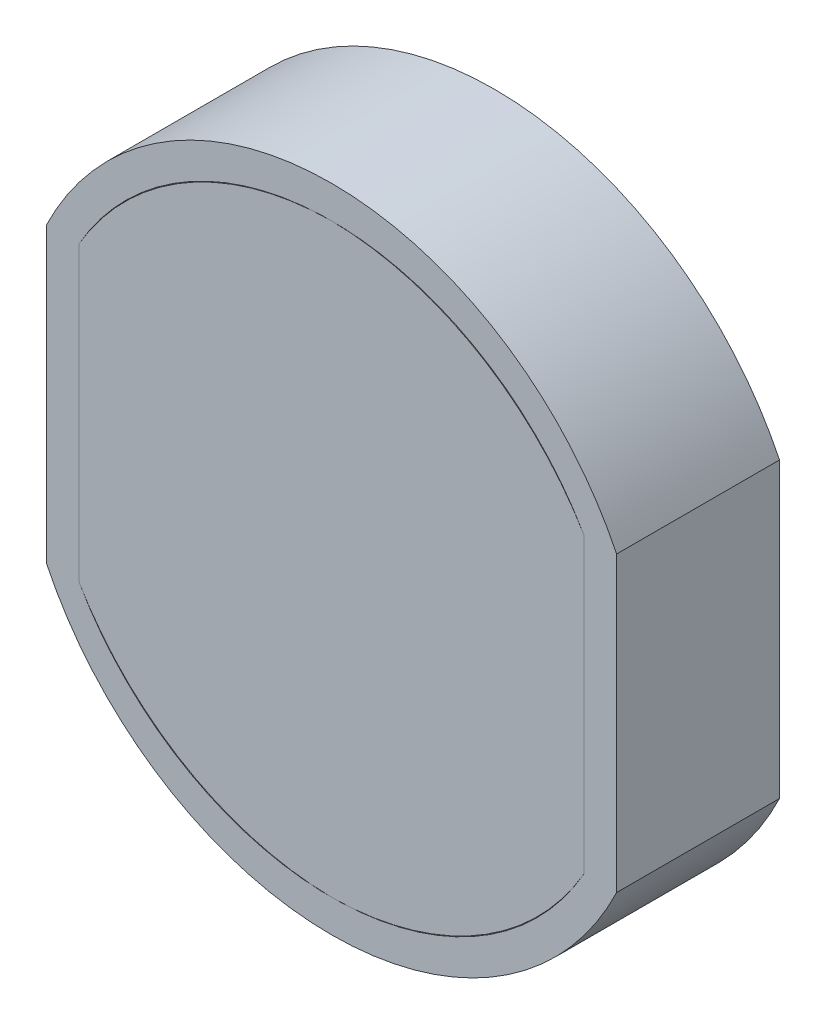
ISO-10303-21;
HEADER;
FILE_DESCRIPTION(('STEP AP214'),'2;1');
FILE_NAME('part.step','',(''),(''),'','','');
FILE_SCHEMA(('AUTOMOTIVE_DESIGN { 1 0 10303 214 1 1 1 1 }'));
ENDSEC;
DATA;
#1=APPLICATION_CONTEXT('core data for automotive mechanical design processes');
#2=APPLICATION_PROTOCOL_DEFINITION('international standard','automotive_design',2000,#1);
#3=PRODUCT_CONTEXT('',#1,'mechanical');
#4=PRODUCT('Part','Part','',(#3));
#5=PRODUCT_RELATED_PRODUCT_CATEGORY('part','',(#4));
#6=PRODUCT_DEFINITION_FORMATION('','',#4);
#7=PRODUCT_DEFINITION_CONTEXT('part definition',#1,'design');
#8=PRODUCT_DEFINITION('design','',#6,#7);
#9=PRODUCT_DEFINITION_SHAPE('','',#8);
#10=(LENGTH_UNIT() NAMED_UNIT(*) SI_UNIT(.MILLI.,.METRE.));
#11=(NAMED_UNIT(*) PLANE_ANGLE_UNIT() SI_UNIT($,.RADIAN.));
#12=(NAMED_UNIT(*) SI_UNIT($,.STERADIAN.) SOLID_ANGLE_UNIT());
#13=UNCERTAINTY_MEASURE_WITH_UNIT(LENGTH_MEASURE(1.E-05),#10,'distance_accuracy_value','');
#14=(GEOMETRIC_REPRESENTATION_CONTEXT(3) GLOBAL_UNCERTAINTY_ASSIGNED_CONTEXT((#13)) GLOBAL_UNIT_ASSIGNED_CONTEXT((#10,
#11,#12)) REPRESENTATION_CONTEXT('',''));
#15=CARTESIAN_POINT('',(0.,0.,0.));
#16=DIRECTION('',(0.,0.,1.));
#17=DIRECTION('',(1.,0.,0.));
#18=AXIS2_PLACEMENT_3D('',#15,#16,#17);
#19=CARTESIAN_POINT('',(192.028654587792,-100.042047155258,-8.49));
#20=DIRECTION('',(0.,0.,-1.));
#21=DIRECTION('',(-1.,0.,0.));
#22=AXIS2_PLACEMENT_3D('',#19,#20,#21);
#23=PLANE('',#22);
#24=CARTESIAN_POINT('',(192.028654587792,-100.042047155258,-8.49));
#25=DIRECTION('',(0.,0.,-1.));
#26=DIRECTION('',(-1.,0.,0.));
#27=AXIS2_PLACEMENT_3D('',#24,#25,#26);
#28=CIRCLE('',#27,19.4204878448053);
#29=CARTESIAN_POINT('',(209.528676,-108.462534,-8.49));
#30=VERTEX_POINT('',#29);
#31=CARTESIAN_POINT('',(174.528676,-108.462623,-8.49));
#32=VERTEX_POINT('',#31);
#33=EDGE_CURVE('P0_E140',#30,#32,#28,.T.);
#34=ORIENTED_EDGE('',*,*,#33,.T.);
#35=DIRECTION('',(0.,1.,0.));
#36=VECTOR('',#35,1.);
#37=CARTESIAN_POINT('',(174.528676,-108.462623,-8.49));
#38=LINE('',#37,#36);
#39=CARTESIAN_POINT('',(174.528676,-90.462535,-8.49));
#40=VERTEX_POINT('',#39);
#41=EDGE_CURVE('P0_E143',#32,#40,#38,.T.);
#42=ORIENTED_EDGE('',*,*,#41,.T.);
#43=CARTESIAN_POINT('',(192.028676,-98.9512156574275,-8.49));
#44=DIRECTION('',(0.,0.,-1.));
#45=DIRECTION('',(1.,0.,0.));
#46=AXIS2_PLACEMENT_3D('',#43,#44,#45);
#47=CIRCLE('',#46,19.4501336577357);
#48=CARTESIAN_POINT('',(209.528676,-90.462535,-8.49));
#49=VERTEX_POINT('',#48);
#50=EDGE_CURVE('P0_E146',#40,#49,#47,.T.);
#51=ORIENTED_EDGE('',*,*,#50,.T.);
#52=DIRECTION('',(0.,-1.,0.));
#53=VECTOR('',#52,1.);
#54=CARTESIAN_POINT('',(209.528676,-90.462535,-8.49));
#55=LINE('',#54,#53);
#56=EDGE_CURVE('P0_E148',#49,#30,#55,.T.);
#57=ORIENTED_EDGE('',*,*,#56,.T.);
#58=EDGE_LOOP('',(#34,#42,#51,#57));
#59=FACE_BOUND('',#58,.T.);
#60=DIRECTION('',(0.,-1.,0.));
#61=VECTOR('',#60,1.);
#62=CARTESIAN_POINT('',(207.528676,-90.462535,-8.49));
#63=LINE('',#62,#61);
#64=CARTESIAN_POINT('',(207.528676,-90.462535,-8.49));
#65=VERTEX_POINT('',#64);
#66=CARTESIAN_POINT('',(207.528676,-108.462534,-8.49));
#67=VERTEX_POINT('',#66);
#68=EDGE_CURVE('P0_E112',#65,#67,#63,.T.);
#69=ORIENTED_EDGE('',*,*,#68,.F.);
#70=CARTESIAN_POINT('',(192.028676,-99.3864427701889,-8.49));
#71=DIRECTION('',(0.,0.,-1.));
#72=DIRECTION('',(1.,0.,0.));
#73=AXIS2_PLACEMENT_3D('',#70,#71,#72);
#74=CIRCLE('',#73,17.8853607704972);
#75=CARTESIAN_POINT('',(176.528676,-90.462535,-8.49));
#76=VERTEX_POINT('',#75);
#77=EDGE_CURVE('P0_E104',#76,#65,#74,.T.);
#78=ORIENTED_EDGE('',*,*,#77,.F.);
#79=DIRECTION('',(0.,1.,0.));
#80=VECTOR('',#79,1.);
#81=CARTESIAN_POINT('',(176.528676,-108.462623,-8.49));
#82=LINE('',#81,#80);
#83=CARTESIAN_POINT('',(176.528676,-108.462623,-8.49));
#84=VERTEX_POINT('',#83);
#85=EDGE_CURVE('P0_E126',#84,#76,#82,.T.);
#86=ORIENTED_EDGE('',*,*,#85,.F.);
#87=CARTESIAN_POINT('',(192.028650600366,-99.615515021127,-8.49));
#88=DIRECTION('',(0.,0.,-1.));
#89=DIRECTION('',(-1.,0.,0.));
#90=AXIS2_PLACEMENT_3D('',#87,#88,#89);
#91=CIRCLE('',#90,17.8471435305999);
#92=EDGE_CURVE('P0_E124',#67,#84,#91,.T.);
#93=ORIENTED_EDGE('',*,*,#92,.F.);
#94=EDGE_LOOP('',(#69,#78,#86,#93));
#95=FACE_BOUND('',#94,.T.);
#96=ADVANCED_FACE('P0_F39',(#59,#95),#23,.T.);
#97=CARTESIAN_POINT('',(192.028654587792,-100.042047155258,1.51));
#98=DIRECTION('',(0.,0.,-1.));
#99=DIRECTION('',(-1.,0.,0.));
#100=AXIS2_PLACEMENT_3D('',#97,#98,#99);
#101=PLANE('',#100);
#102=CARTESIAN_POINT('',(192.028654587792,-100.042047155258,1.51));
#103=DIRECTION('',(0.,0.,-1.));
#104=DIRECTION('',(-1.,0.,0.));
#105=AXIS2_PLACEMENT_3D('',#102,#103,#104);
#106=CIRCLE('',#105,19.4204878448053);
#107=CARTESIAN_POINT('',(209.528676,-108.462534,1.51));
#108=VERTEX_POINT('',#107);
#109=CARTESIAN_POINT('',(174.528676,-108.462623,1.51));
#110=VERTEX_POINT('',#109);
#111=EDGE_CURVE('P0_E120',#108,#110,#106,.T.);
#112=ORIENTED_EDGE('',*,*,#111,.F.);
#113=DIRECTION('',(0.,-1.,0.));
#114=VECTOR('',#113,1.);
#115=CARTESIAN_POINT('',(209.528676,-90.462535,1.51));
#116=LINE('',#115,#114);
#117=CARTESIAN_POINT('',(209.528676,-90.462535,1.51));
#118=VERTEX_POINT('',#117);
#119=EDGE_CURVE('P0_E144',#118,#108,#116,.T.);
#120=ORIENTED_EDGE('',*,*,#119,.F.);
#121=CARTESIAN_POINT('',(192.028676,-98.9512156574275,1.51));
#122=DIRECTION('',(0.,0.,-1.));
#123=DIRECTION('',(1.,0.,0.));
#124=AXIS2_PLACEMENT_3D('',#121,#122,#123);
#125=CIRCLE('',#124,19.4501336577357);
#126=CARTESIAN_POINT('',(174.528676,-90.462535,1.51));
#127=VERTEX_POINT('',#126);
#128=EDGE_CURVE('P0_E155',#127,#118,#125,.T.);
#129=ORIENTED_EDGE('',*,*,#128,.F.);
#130=DIRECTION('',(0.,1.,0.));
#131=VECTOR('',#130,1.);
#132=CARTESIAN_POINT('',(174.528676,-108.462623,1.51));
#133=LINE('',#132,#131);
#134=EDGE_CURVE('P0_E153',#110,#127,#133,.T.);
#135=ORIENTED_EDGE('',*,*,#134,.F.);
#136=EDGE_LOOP('',(#112,#120,#129,#135));
#137=FACE_BOUND('',#136,.T.);
#138=CARTESIAN_POINT('',(192.028676,-99.3864427701889,1.51));
#139=DIRECTION('',(0.,0.,-1.));
#140=DIRECTION('',(1.,0.,0.));
#141=AXIS2_PLACEMENT_3D('',#138,#139,#140);
#142=CIRCLE('',#141,17.8853607704972);
#143=CARTESIAN_POINT('',(176.528676,-90.462535,1.51));
#144=VERTEX_POINT('',#143);
#145=CARTESIAN_POINT('',(207.528676,-90.462535,1.51));
#146=VERTEX_POINT('',#145);
#147=EDGE_CURVE('P0_E62',#144,#146,#142,.T.);
#148=ORIENTED_EDGE('',*,*,#147,.T.);
#149=DIRECTION('',(0.,-1.,0.));
#150=VECTOR('',#149,1.);
#151=CARTESIAN_POINT('',(207.528676,-90.462535,1.51));
#152=LINE('',#151,#150);
#153=CARTESIAN_POINT('',(207.528676,-108.462534,1.51));
#154=VERTEX_POINT('',#153);
#155=EDGE_CURVE('P0_E119',#146,#154,#152,.T.);
#156=ORIENTED_EDGE('',*,*,#155,.T.);
#157=CARTESIAN_POINT('',(192.028650600366,-99.615515021127,1.51));
#158=DIRECTION('',(0.,0.,-1.));
#159=DIRECTION('',(-1.,0.,0.));
#160=AXIS2_PLACEMENT_3D('',#157,#158,#159);
#161=CIRCLE('',#160,17.8471435305999);
#162=CARTESIAN_POINT('',(176.528676,-108.462623,1.51));
#163=VERTEX_POINT('',#162);
#164=EDGE_CURVE('P0_E132',#154,#163,#161,.T.);
#165=ORIENTED_EDGE('',*,*,#164,.T.);
#166=DIRECTION('',(0.,1.,0.));
#167=VECTOR('',#166,1.);
#168=CARTESIAN_POINT('',(176.528676,-108.462623,1.51));
#169=LINE('',#168,#167);
#170=EDGE_CURVE('P0_E113',#163,#144,#169,.T.);
#171=ORIENTED_EDGE('',*,*,#170,.T.);
#172=EDGE_LOOP('',(#148,#156,#165,#171));
#173=FACE_BOUND('',#172,.T.);
#174=ADVANCED_FACE('P0_F173',(#137,#173),#101,.F.);
#175=CARTESIAN_POINT('',(192.028654587792,-100.042047155258,-8.49));
#176=DIRECTION('',(0.,0.,1.));
#177=DIRECTION('',(1.,0.,0.));
#178=AXIS2_PLACEMENT_3D('',#175,#176,#177);
#179=CYLINDRICAL_SURFACE('',#178,19.4204878448053);
#180=ORIENTED_EDGE('',*,*,#111,.T.);
#181=DIRECTION('',(0.,0.,1.));
#182=VECTOR('',#181,1.);
#183=CARTESIAN_POINT('',(174.528676,-108.462623,-8.49));
#184=LINE('',#183,#182);
#185=EDGE_CURVE('P0_E11',#32,#110,#184,.T.);
#186=ORIENTED_EDGE('',*,*,#185,.F.);
#187=ORIENTED_EDGE('',*,*,#33,.F.);
#188=DIRECTION('',(0.,0.,1.));
#189=VECTOR('',#188,1.);
#190=CARTESIAN_POINT('',(209.528676,-108.462534,-8.49));
#191=LINE('',#190,#189);
#192=EDGE_CURVE('P0_E150',#30,#108,#191,.T.);
#193=ORIENTED_EDGE('',*,*,#192,.T.);
#194=EDGE_LOOP('',(#180,#186,#187,#193));
#195=FACE_BOUND('',#194,.T.);
#196=ADVANCED_FACE('P0_F41',(#195),#179,.T.);
#197=CARTESIAN_POINT('',(174.528676,-108.462623,-8.49));
#198=DIRECTION('',(1.,0.,0.));
#199=DIRECTION('',(0.,0.,-1.));
#200=AXIS2_PLACEMENT_3D('',#197,#198,#199);
#201=PLANE('',#200);
#202=ORIENTED_EDGE('',*,*,#134,.T.);
#203=DIRECTION('',(0.,0.,1.));
#204=VECTOR('',#203,1.);
#205=CARTESIAN_POINT('',(174.528676,-90.462535,-8.49));
#206=LINE('',#205,#204);
#207=EDGE_CURVE('P0_E47',#40,#127,#206,.T.);
#208=ORIENTED_EDGE('',*,*,#207,.F.);
#209=ORIENTED_EDGE('',*,*,#41,.F.);
#210=ORIENTED_EDGE('',*,*,#185,.T.);
#211=EDGE_LOOP('',(#202,#208,#209,#210));
#212=FACE_BOUND('',#211,.T.);
#213=ADVANCED_FACE('P0_F183',(#212),#201,.F.);
#214=CARTESIAN_POINT('',(192.028676,-98.9512156574275,-8.49));
#215=DIRECTION('',(0.,0.,1.));
#216=DIRECTION('',(1.,0.,0.));
#217=AXIS2_PLACEMENT_3D('',#214,#215,#216);
#218=CYLINDRICAL_SURFACE('',#217,19.4501336577357);
#219=ORIENTED_EDGE('',*,*,#128,.T.);
#220=DIRECTION('',(0.,0.,1.));
#221=VECTOR('',#220,1.);
#222=CARTESIAN_POINT('',(209.528676,-90.462535,-8.49));
#223=LINE('',#222,#221);
#224=EDGE_CURVE('P0_E160',#49,#118,#223,.T.);
#225=ORIENTED_EDGE('',*,*,#224,.F.);
#226=ORIENTED_EDGE('',*,*,#50,.F.);
#227=ORIENTED_EDGE('',*,*,#207,.T.);
#228=EDGE_LOOP('',(#219,#225,#226,#227));
#229=FACE_BOUND('',#228,.T.);
#230=ADVANCED_FACE('P0_F167',(#229),#218,.T.);
#231=CARTESIAN_POINT('',(209.528676,-90.462535,-8.49));
#232=DIRECTION('',(-1.,0.,0.));
#233=DIRECTION('',(0.,0.,1.));
#234=AXIS2_PLACEMENT_3D('',#231,#232,#233);
#235=PLANE('',#234);
#236=ORIENTED_EDGE('',*,*,#119,.T.);
#237=ORIENTED_EDGE('',*,*,#192,.F.);
#238=ORIENTED_EDGE('',*,*,#56,.F.);
#239=ORIENTED_EDGE('',*,*,#224,.T.);
#240=EDGE_LOOP('',(#236,#237,#238,#239));
#241=FACE_BOUND('',#240,.T.);
#242=ADVANCED_FACE('P0_F177',(#241),#235,.F.);
#243=CARTESIAN_POINT('',(192.028676,-99.3864427701889,-8.49));
#244=DIRECTION('',(0.,0.,1.));
#245=DIRECTION('',(1.,0.,0.));
#246=AXIS2_PLACEMENT_3D('',#243,#244,#245);
#247=CYLINDRICAL_SURFACE('',#246,17.8853607704972);
#248=ORIENTED_EDGE('',*,*,#147,.F.);
#249=DIRECTION('',(0.,0.,1.));
#250=VECTOR('',#249,1.);
#251=CARTESIAN_POINT('',(176.528676,-90.462535,-8.49));
#252=LINE('',#251,#250);
#253=EDGE_CURVE('P0_E108',#76,#144,#252,.T.);
#254=ORIENTED_EDGE('',*,*,#253,.F.);
#255=ORIENTED_EDGE('',*,*,#77,.T.);
#256=DIRECTION('',(0.,0.,1.));
#257=VECTOR('',#256,1.);
#258=CARTESIAN_POINT('',(207.528676,-90.462535,-8.49));
#259=LINE('',#258,#257);
#260=EDGE_CURVE('P0_E107',#65,#146,#259,.T.);
#261=ORIENTED_EDGE('',*,*,#260,.T.);
#262=EDGE_LOOP('',(#248,#254,#255,#261));
#263=FACE_BOUND('',#262,.T.);
#264=ADVANCED_FACE('P0_F106',(#263),#247,.F.);
#265=CARTESIAN_POINT('',(207.528676,-90.462535,-8.49));
#266=DIRECTION('',(-1.,0.,0.));
#267=DIRECTION('',(0.,0.,1.));
#268=AXIS2_PLACEMENT_3D('',#265,#266,#267);
#269=PLANE('',#268);
#270=ORIENTED_EDGE('',*,*,#155,.F.);
#271=ORIENTED_EDGE('',*,*,#260,.F.);
#272=ORIENTED_EDGE('',*,*,#68,.T.);
#273=DIRECTION('',(0.,0.,1.));
#274=VECTOR('',#273,1.);
#275=CARTESIAN_POINT('',(207.528676,-108.462534,-8.49));
#276=LINE('',#275,#274);
#277=EDGE_CURVE('P0_E121',#67,#154,#276,.T.);
#278=ORIENTED_EDGE('',*,*,#277,.T.);
#279=EDGE_LOOP('',(#270,#271,#272,#278));
#280=FACE_BOUND('',#279,.T.);
#281=ADVANCED_FACE('P0_F116',(#280),#269,.T.);
#282=CARTESIAN_POINT('',(192.028650600366,-99.615515021127,-8.49));
#283=DIRECTION('',(0.,0.,1.));
#284=DIRECTION('',(1.,0.,0.));
#285=AXIS2_PLACEMENT_3D('',#282,#283,#284);
#286=CYLINDRICAL_SURFACE('',#285,17.8471435305999);
#287=ORIENTED_EDGE('',*,*,#164,.F.);
#288=ORIENTED_EDGE('',*,*,#277,.F.);
#289=ORIENTED_EDGE('',*,*,#92,.T.);
#290=DIRECTION('',(0.,0.,1.));
#291=VECTOR('',#290,1.);
#292=CARTESIAN_POINT('',(176.528676,-108.462623,-8.49));
#293=LINE('',#292,#291);
#294=EDGE_CURVE('P0_E54',#84,#163,#293,.T.);
#295=ORIENTED_EDGE('',*,*,#294,.T.);
#296=EDGE_LOOP('',(#287,#288,#289,#295));
#297=FACE_BOUND('',#296,.T.);
#298=ADVANCED_FACE('P0_F206',(#297),#286,.F.);
#299=CARTESIAN_POINT('',(176.528676,-108.462623,-8.49));
#300=DIRECTION('',(1.,0.,0.));
#301=DIRECTION('',(0.,0.,-1.));
#302=AXIS2_PLACEMENT_3D('',#299,#300,#301);
#303=PLANE('',#302);
#304=ORIENTED_EDGE('',*,*,#170,.F.);
#305=ORIENTED_EDGE('',*,*,#294,.F.);
#306=ORIENTED_EDGE('',*,*,#85,.T.);
#307=ORIENTED_EDGE('',*,*,#253,.T.);
#308=EDGE_LOOP('',(#304,#305,#306,#307));
#309=FACE_BOUND('',#308,.T.);
#310=ADVANCED_FACE('P0_F210',(#309),#303,.T.);
#311=CLOSED_SHELL('',(#96,#174,#196,#213,#230,#242,#264,#281,#298,#310));
#312=MANIFOLD_SOLID_BREP('P0_B2',#311);
#313=CARTESIAN_POINT('',(0.,0.,1.51));
#314=DIRECTION('',(0.,0.,1.));
#315=DIRECTION('',(1.,0.,0.));
#316=AXIS2_PLACEMENT_3D('',#313,#314,#315);
#317=PLANE('',#316);
#318=CARTESIAN_POINT('',(192.17241642714,-99.63506224222,1.51));
#319=DIRECTION('',(0.,0.,-1.));
#320=DIRECTION('',(-0.86264843712141,0.50580398765924,0.));
#321=AXIS2_PLACEMENT_3D('',#318,#319,#320);
#322=CIRCLE('',#321,18.134549086245);
#323=CARTESIAN_POINT('',(176.528676,-90.462535,1.51));
#324=VERTEX_POINT('',#323);
#325=CARTESIAN_POINT('',(192.028781,-81.501082,1.51));
#326=VERTEX_POINT('',#325);
#327=EDGE_CURVE('P1_E25',#324,#326,#322,.T.);
#328=ORIENTED_EDGE('',*,*,#327,.F.);
#329=DIRECTION('',(0.,1.,0.));
#330=VECTOR('',#329,1.);
#331=CARTESIAN_POINT('',(176.528676,-108.462623,1.51));
#332=LINE('',#331,#330);
#333=CARTESIAN_POINT('',(176.528676,-108.462623,1.51));
#334=VERTEX_POINT('',#333);
#335=EDGE_CURVE('P1_E97',#334,#324,#332,.T.);
#336=ORIENTED_EDGE('',*,*,#335,.F.);
#337=CARTESIAN_POINT('',(192.24085496437,-99.2498013461,1.51));
#338=DIRECTION('',(0.,0.,-1.));
#339=DIRECTION('',(-0.0116492440239865,-0.999932145254702,0.));
#340=AXIS2_PLACEMENT_3D('',#337,#338,#339);
#341=CIRCLE('',#340,18.21396855809);
#342=CARTESIAN_POINT('',(192.028676,-117.462534,1.51));
#343=VERTEX_POINT('',#342);
#344=EDGE_CURVE('P1_E91',#343,#334,#341,.T.);
#345=ORIENTED_EDGE('',*,*,#344,.F.);
#346=DIRECTION('',(-0.999999999886537,1.5064097696113E-05,0.));
#347=VECTOR('',#346,1.);
#348=CARTESIAN_POINT('',(192.095059,-117.462535,1.51));
#349=LINE('',#348,#347);
#350=CARTESIAN_POINT('',(192.095059,-117.462535,1.51));
#351=VERTEX_POINT('',#350);
#352=EDGE_CURVE('P1_E94',#351,#343,#349,.T.);
#353=ORIENTED_EDGE('',*,*,#352,.F.);
#354=CARTESIAN_POINT('',(191.88415859083,-99.36773345591,1.51));
#355=DIRECTION('',(0.,0.,-1.));
#356=DIRECTION('',(0.864527574724491,-0.502585388308285,0.));
#357=AXIS2_PLACEMENT_3D('',#354,#355,#356);
#358=CIRCLE('',#357,18.096030556519);
#359=CARTESIAN_POINT('',(207.528676,-108.462534,1.51));
#360=VERTEX_POINT('',#359);
#361=EDGE_CURVE('P1_E178',#360,#351,#358,.T.);
#362=ORIENTED_EDGE('',*,*,#361,.F.);
#363=DIRECTION('',(0.,-1.,0.));
#364=VECTOR('',#363,1.);
#365=CARTESIAN_POINT('',(207.528676,-90.462535,1.51));
#366=LINE('',#365,#364);
#367=CARTESIAN_POINT('',(207.528676,-90.462535,1.51));
#368=VERTEX_POINT('',#367);
#369=EDGE_CURVE('P1_E149',#368,#360,#366,.T.);
#370=ORIENTED_EDGE('',*,*,#369,.F.);
#371=CARTESIAN_POINT('',(191.81595154278,-99.75437492926,1.51));
#372=DIRECTION('',(0.,0.,-1.));
#373=DIRECTION('',(0.0116589917429491,0.99993203164592,0.));
#374=AXIS2_PLACEMENT_3D('',#371,#372,#373);
#375=CIRCLE('',#374,18.254533659869);
#376=EDGE_CURVE('P1_E147',#326,#368,#375,.T.);
#377=ORIENTED_EDGE('',*,*,#376,.F.);
#378=EDGE_LOOP('',(#328,#336,#345,#353,#362,#370,#377));
#379=FACE_BOUND('',#378,.T.);
#380=ADVANCED_FACE('P1_F16',(#379),#317,.T.);
#381=CARTESIAN_POINT('',(0.,0.,0.));
#382=DIRECTION('',(0.,0.,1.));
#383=DIRECTION('',(1.,0.,0.));
#384=AXIS2_PLACEMENT_3D('',#381,#382,#383);
#385=PLANE('',#384);
#386=CARTESIAN_POINT('',(191.81595154278,-99.75437492926,0.));
#387=DIRECTION('',(0.,0.,-1.));
#388=DIRECTION('',(0.0116589917429491,0.99993203164592,0.));
#389=AXIS2_PLACEMENT_3D('',#386,#387,#388);
#390=CIRCLE('',#389,18.254533659869);
#391=CARTESIAN_POINT('',(192.028781,-81.501082,0.));
#392=VERTEX_POINT('',#391);
#393=CARTESIAN_POINT('',(207.528676,-90.462535,0.));
#394=VERTEX_POINT('',#393);
#395=EDGE_CURVE('P1_E159',#392,#394,#390,.T.);
#396=ORIENTED_EDGE('',*,*,#395,.T.);
#397=DIRECTION('',(0.,-1.,0.));
#398=VECTOR('',#397,1.);
#399=CARTESIAN_POINT('',(207.528676,-90.462535,0.));
#400=LINE('',#399,#398);
#401=CARTESIAN_POINT('',(207.528676,-108.462534,0.));
#402=VERTEX_POINT('',#401);
#403=EDGE_CURVE('P1_E174',#394,#402,#400,.T.);
#404=ORIENTED_EDGE('',*,*,#403,.T.);
#405=CARTESIAN_POINT('',(191.88415859083,-99.36773345591,0.));
#406=DIRECTION('',(0.,0.,-1.));
#407=DIRECTION('',(0.864527574724491,-0.502585388308285,0.));
#408=AXIS2_PLACEMENT_3D('',#405,#406,#407);
#409=CIRCLE('',#408,18.096030556519);
#410=CARTESIAN_POINT('',(192.095059,-117.462535,0.));
#411=VERTEX_POINT('',#410);
#412=EDGE_CURVE('P1_E119',#402,#411,#409,.T.);
#413=ORIENTED_EDGE('',*,*,#412,.T.);
#414=DIRECTION('',(-0.999999999886537,1.5064097696113E-05,0.));
#415=VECTOR('',#414,1.);
#416=CARTESIAN_POINT('',(192.095059,-117.462535,0.));
#417=LINE('',#416,#415);
#418=CARTESIAN_POINT('',(192.028676,-117.462534,0.));
#419=VERTEX_POINT('',#418);
#420=EDGE_CURVE('P1_E103',#411,#419,#417,.T.);
#421=ORIENTED_EDGE('',*,*,#420,.T.);
#422=CARTESIAN_POINT('',(192.24085496437,-99.2498013461,0.));
#423=DIRECTION('',(0.,0.,-1.));
#424=DIRECTION('',(-0.0116492440239865,-0.999932145254702,0.));
#425=AXIS2_PLACEMENT_3D('',#422,#423,#424);
#426=CIRCLE('',#425,18.21396855809);
#427=CARTESIAN_POINT('',(176.528676,-108.462623,0.));
#428=VERTEX_POINT('',#427);
#429=EDGE_CURVE('P1_E109',#419,#428,#426,.T.);
#430=ORIENTED_EDGE('',*,*,#429,.T.);
#431=DIRECTION('',(0.,1.,0.));
#432=VECTOR('',#431,1.);
#433=CARTESIAN_POINT('',(176.528676,-108.462623,0.));
#434=LINE('',#433,#432);
#435=CARTESIAN_POINT('',(176.528676,-90.462535,0.));
#436=VERTEX_POINT('',#435);
#437=EDGE_CURVE('P1_E138',#428,#436,#434,.T.);
#438=ORIENTED_EDGE('',*,*,#437,.T.);
#439=CARTESIAN_POINT('',(192.17241642714,-99.63506224222,0.));
#440=DIRECTION('',(0.,0.,-1.));
#441=DIRECTION('',(-0.86264843712141,0.50580398765924,0.));
#442=AXIS2_PLACEMENT_3D('',#439,#440,#441);
#443=CIRCLE('',#442,18.134549086245);
#444=EDGE_CURVE('P1_E10',#436,#392,#443,.T.);
#445=ORIENTED_EDGE('',*,*,#444,.T.);
#446=EDGE_LOOP('',(#396,#404,#413,#421,#430,#438,#445));
#447=FACE_BOUND('',#446,.T.);
#448=ADVANCED_FACE('P1_F18',(#447),#385,.F.);
#449=CARTESIAN_POINT('',(192.17241642714,-99.63506224222,0.));
#450=DIRECTION('',(0.,0.,-1.));
#451=DIRECTION('',(-0.86264843712141,0.50580398765924,0.));
#452=AXIS2_PLACEMENT_3D('',#449,#450,#451);
#453=CYLINDRICAL_SURFACE('',#452,18.134549086245);
#454=DIRECTION('',(0.,0.,1.));
#455=VECTOR('',#454,1.);
#456=CARTESIAN_POINT('',(176.528676,-90.462535,0.));
#457=LINE('',#456,#455);
#458=EDGE_CURVE('P1_E135',#436,#324,#457,.T.);
#459=ORIENTED_EDGE('',*,*,#458,.T.);
#460=ORIENTED_EDGE('',*,*,#327,.T.);
#461=DIRECTION('',(0.,0.,1.));
#462=VECTOR('',#461,1.);
#463=CARTESIAN_POINT('',(192.028781,-81.501082,0.));
#464=LINE('',#463,#462);
#465=EDGE_CURVE('P1_E144',#392,#326,#464,.T.);
#466=ORIENTED_EDGE('',*,*,#465,.F.);
#467=ORIENTED_EDGE('',*,*,#444,.F.);
#468=EDGE_LOOP('',(#459,#460,#466,#467));
#469=FACE_BOUND('',#468,.T.);
#470=ADVANCED_FACE('P1_F142',(#469),#453,.T.);
#471=CARTESIAN_POINT('',(176.528676,-108.462623,0.));
#472=DIRECTION('',(-1.,0.,0.));
#473=DIRECTION('',(0.,0.,1.));
#474=AXIS2_PLACEMENT_3D('',#471,#472,#473);
#475=PLANE('',#474);
#476=DIRECTION('',(0.,0.,1.));
#477=VECTOR('',#476,1.);
#478=CARTESIAN_POINT('',(176.528676,-108.462623,0.));
#479=LINE('',#478,#477);
#480=EDGE_CURVE('P1_E102',#428,#334,#479,.T.);
#481=ORIENTED_EDGE('',*,*,#480,.T.);
#482=ORIENTED_EDGE('',*,*,#335,.T.);
#483=ORIENTED_EDGE('',*,*,#458,.F.);
#484=ORIENTED_EDGE('',*,*,#437,.F.);
#485=EDGE_LOOP('',(#481,#482,#483,#484));
#486=FACE_BOUND('',#485,.T.);
#487=ADVANCED_FACE('P1_F183',(#486),#475,.T.);
#488=CARTESIAN_POINT('',(192.24085496437,-99.2498013461,0.));
#489=DIRECTION('',(0.,0.,-1.));
#490=DIRECTION('',(-0.0116492440239865,-0.999932145254702,0.));
#491=AXIS2_PLACEMENT_3D('',#488,#489,#490);
#492=CYLINDRICAL_SURFACE('',#491,18.21396855809);
#493=DIRECTION('',(0.,0.,1.));
#494=VECTOR('',#493,1.);
#495=CARTESIAN_POINT('',(192.028676,-117.462534,0.));
#496=LINE('',#495,#494);
#497=EDGE_CURVE('P1_E106',#419,#343,#496,.T.);
#498=ORIENTED_EDGE('',*,*,#497,.T.);
#499=ORIENTED_EDGE('',*,*,#344,.T.);
#500=ORIENTED_EDGE('',*,*,#480,.F.);
#501=ORIENTED_EDGE('',*,*,#429,.F.);
#502=EDGE_LOOP('',(#498,#499,#500,#501));
#503=FACE_BOUND('',#502,.T.);
#504=ADVANCED_FACE('P1_F107',(#503),#492,.T.);
#505=CARTESIAN_POINT('',(192.095059,-117.462535,0.));
#506=DIRECTION('',(-1.5064097696113E-05,-0.999999999886537,0.));
#507=DIRECTION('',(-0.999999999886537,1.5064097696113E-05,0.));
#508=AXIS2_PLACEMENT_3D('',#505,#506,#507);
#509=PLANE('',#508);
#510=DIRECTION('',(0.,0.,1.));
#511=VECTOR('',#510,1.);
#512=CARTESIAN_POINT('',(192.095059,-117.462535,0.));
#513=LINE('',#512,#511);
#514=EDGE_CURVE('P1_E116',#411,#351,#513,.T.);
#515=ORIENTED_EDGE('',*,*,#514,.T.);
#516=ORIENTED_EDGE('',*,*,#352,.T.);
#517=ORIENTED_EDGE('',*,*,#497,.F.);
#518=ORIENTED_EDGE('',*,*,#420,.F.);
#519=EDGE_LOOP('',(#515,#516,#517,#518));
#520=FACE_BOUND('',#519,.T.);
#521=ADVANCED_FACE('P1_F114',(#520),#509,.T.);
#522=CARTESIAN_POINT('',(191.88415859083,-99.36773345591,0.));
#523=DIRECTION('',(0.,0.,-1.));
#524=DIRECTION('',(0.864527574724491,-0.502585388308286,0.));
#525=AXIS2_PLACEMENT_3D('',#522,#523,#524);
#526=CYLINDRICAL_SURFACE('',#525,18.096030556519);
#527=DIRECTION('',(0.,0.,1.));
#528=VECTOR('',#527,1.);
#529=CARTESIAN_POINT('',(207.528676,-108.462534,0.));
#530=LINE('',#529,#528);
#531=EDGE_CURVE('P1_E170',#402,#360,#530,.T.);
#532=ORIENTED_EDGE('',*,*,#531,.T.);
#533=ORIENTED_EDGE('',*,*,#361,.T.);
#534=ORIENTED_EDGE('',*,*,#514,.F.);
#535=ORIENTED_EDGE('',*,*,#412,.F.);
#536=EDGE_LOOP('',(#532,#533,#534,#535));
#537=FACE_BOUND('',#536,.T.);
#538=ADVANCED_FACE('P1_F187',(#537),#526,.T.);
#539=CARTESIAN_POINT('',(207.528676,-90.462535,0.));
#540=DIRECTION('',(1.,0.,0.));
#541=DIRECTION('',(0.,1.,0.));
#542=AXIS2_PLACEMENT_3D('',#539,#540,#541);
#543=PLANE('',#542);
#544=DIRECTION('',(0.,0.,1.));
#545=VECTOR('',#544,1.);
#546=CARTESIAN_POINT('',(207.528676,-90.462535,0.));
#547=LINE('',#546,#545);
#548=EDGE_CURVE('P1_E154',#394,#368,#547,.T.);
#549=ORIENTED_EDGE('',*,*,#548,.T.);
#550=ORIENTED_EDGE('',*,*,#369,.T.);
#551=ORIENTED_EDGE('',*,*,#531,.F.);
#552=ORIENTED_EDGE('',*,*,#403,.F.);
#553=EDGE_LOOP('',(#549,#550,#551,#552));
#554=FACE_BOUND('',#553,.T.);
#555=ADVANCED_FACE('P1_F192',(#554),#543,.T.);
#556=CARTESIAN_POINT('',(191.81595154278,-99.75437492926,0.));
#557=DIRECTION('',(0.,0.,-1.));
#558=DIRECTION('',(0.0116589917429491,0.99993203164592,0.));
#559=AXIS2_PLACEMENT_3D('',#556,#557,#558);
#560=CYLINDRICAL_SURFACE('',#559,18.254533659869);
#561=ORIENTED_EDGE('',*,*,#465,.T.);
#562=ORIENTED_EDGE('',*,*,#376,.T.);
#563=ORIENTED_EDGE('',*,*,#548,.F.);
#564=ORIENTED_EDGE('',*,*,#395,.F.);
#565=EDGE_LOOP('',(#561,#562,#563,#564));
#566=FACE_BOUND('',#565,.T.);
#567=ADVANCED_FACE('P1_F157',(#566),#560,.T.);
#568=CLOSED_SHELL('',(#380,#448,#470,#487,#504,#521,#538,#555,#567));
#569=MANIFOLD_SOLID_BREP('P1_B1',#568);
#570=ADVANCED_BREP_SHAPE_REPRESENTATION('',(#18,#312,#569),#14);
#571=SHAPE_DEFINITION_REPRESENTATION(#9,#570);
ENDSEC;
END-ISO-10303-21;
